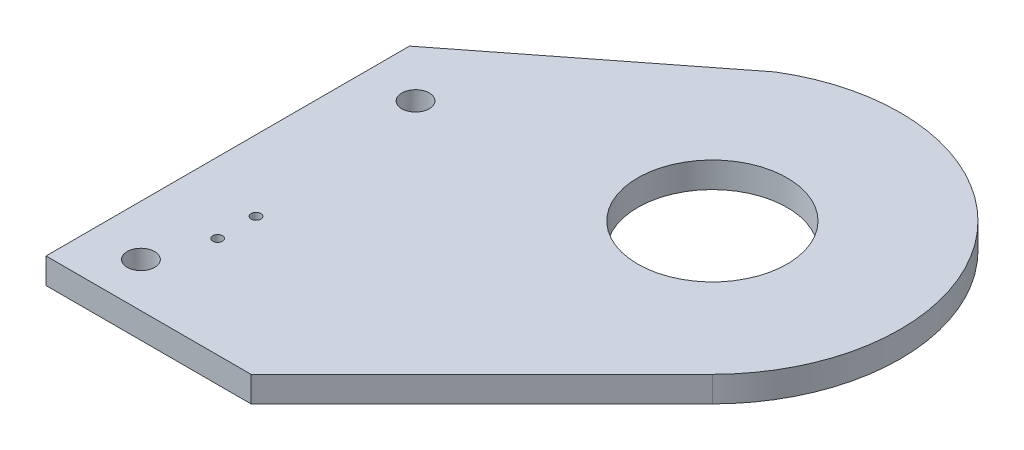
ISO-10303-21;
HEADER;
FILE_DESCRIPTION(('STEP AP214'),'2;1');
FILE_NAME('part.step','',(''),(''),'','','');
FILE_SCHEMA(('AUTOMOTIVE_DESIGN { 1 0 10303 214 1 1 1 1 }'));
ENDSEC;
DATA;
#1=APPLICATION_CONTEXT('core data for automotive mechanical design processes');
#2=APPLICATION_PROTOCOL_DEFINITION('international standard','automotive_design',2000,#1);
#3=PRODUCT_CONTEXT('',#1,'mechanical');
#4=PRODUCT('Part','Part','',(#3));
#5=PRODUCT_RELATED_PRODUCT_CATEGORY('part','',(#4));
#6=PRODUCT_DEFINITION_FORMATION('','',#4);
#7=PRODUCT_DEFINITION_CONTEXT('part definition',#1,'design');
#8=PRODUCT_DEFINITION('design','',#6,#7);
#9=PRODUCT_DEFINITION_SHAPE('','',#8);
#10=(LENGTH_UNIT() NAMED_UNIT(*) SI_UNIT(.MILLI.,.METRE.));
#11=(NAMED_UNIT(*) PLANE_ANGLE_UNIT() SI_UNIT($,.RADIAN.));
#12=(NAMED_UNIT(*) SI_UNIT($,.STERADIAN.) SOLID_ANGLE_UNIT());
#13=UNCERTAINTY_MEASURE_WITH_UNIT(LENGTH_MEASURE(1.E-05),#10,'distance_accuracy_value','');
#14=(GEOMETRIC_REPRESENTATION_CONTEXT(3) GLOBAL_UNCERTAINTY_ASSIGNED_CONTEXT((#13)) GLOBAL_UNIT_ASSIGNED_CONTEXT((#10,
#11,#12)) REPRESENTATION_CONTEXT('',''));
#15=CARTESIAN_POINT('',(0.,0.,0.));
#16=DIRECTION('',(0.,0.,1.));
#17=DIRECTION('',(1.,0.,0.));
#18=AXIS2_PLACEMENT_3D('',#15,#16,#17);
#19=CARTESIAN_POINT('',(0.,-6.35,0.));
#20=DIRECTION('',(-1.,0.,0.));
#21=DIRECTION('',(0.,0.,1.));
#22=AXIS2_PLACEMENT_3D('',#19,#20,#21);
#23=PLANE('',#22);
#24=DIRECTION('',(0.,0.,1.));
#25=VECTOR('',#24,1.);
#26=CARTESIAN_POINT('',(0.,0.,0.));
#27=LINE('',#26,#25);
#28=CARTESIAN_POINT('',(0.,0.,-90.));
#29=VERTEX_POINT('',#28);
#30=CARTESIAN_POINT('',(0.,0.,0.));
#31=VERTEX_POINT('',#30);
#32=EDGE_CURVE('E118',#29,#31,#27,.T.);
#33=ORIENTED_EDGE('',*,*,#32,.F.);
#34=DIRECTION('',(0.,1.,0.));
#35=VECTOR('',#34,1.);
#36=CARTESIAN_POINT('',(0.,-6.35,-90.));
#37=LINE('',#36,#35);
#38=CARTESIAN_POINT('',(0.,-6.35,-90.));
#39=VERTEX_POINT('',#38);
#40=EDGE_CURVE('E11',#39,#29,#37,.T.);
#41=ORIENTED_EDGE('',*,*,#40,.F.);
#42=DIRECTION('',(0.,0.,1.));
#43=VECTOR('',#42,1.);
#44=CARTESIAN_POINT('',(0.,-6.35,0.));
#45=LINE('',#44,#43);
#46=CARTESIAN_POINT('',(0.,-6.35,0.));
#47=VERTEX_POINT('',#46);
#48=EDGE_CURVE('E113',#39,#47,#45,.T.);
#49=ORIENTED_EDGE('',*,*,#48,.T.);
#50=DIRECTION('',(0.,1.,0.));
#51=VECTOR('',#50,1.);
#52=CARTESIAN_POINT('',(0.,-6.35,0.));
#53=LINE('',#52,#51);
#54=EDGE_CURVE('E44',#47,#31,#53,.T.);
#55=ORIENTED_EDGE('',*,*,#54,.T.);
#56=EDGE_LOOP('',(#33,#41,#49,#55));
#57=FACE_BOUND('',#56,.T.);
#58=ADVANCED_FACE('F41',(#57),#23,.T.);
#59=CARTESIAN_POINT('',(0.,-6.35,-90.));
#60=DIRECTION('',(-0.615892028317826,0.,-0.787830571540959));
#61=DIRECTION('',(-0.787830571540959,0.,0.615892028317826));
#62=AXIS2_PLACEMENT_3D('',#59,#60,#61);
#63=PLANE('',#62);
#64=DIRECTION('',(-0.787830571540959,0.,0.615892028317826));
#65=VECTOR('',#64,1.);
#66=CARTESIAN_POINT('',(0.,0.,-90.));
#67=LINE('',#66,#65);
#68=CARTESIAN_POINT('',(50.7609306503488,0.,-129.682710555893));
#69=VERTEX_POINT('',#68);
#70=EDGE_CURVE('E128',#69,#29,#67,.T.);
#71=ORIENTED_EDGE('',*,*,#70,.F.);
#72=DIRECTION('',(0.,1.,0.));
#73=VECTOR('',#72,1.);
#74=CARTESIAN_POINT('',(50.7609306503488,-6.35,-129.682710555893));
#75=LINE('',#74,#73);
#76=CARTESIAN_POINT('',(50.7609306503488,-6.35,-129.682710555893));
#77=VERTEX_POINT('',#76);
#78=EDGE_CURVE('E50',#77,#69,#75,.T.);
#79=ORIENTED_EDGE('',*,*,#78,.F.);
#80=DIRECTION('',(-0.787830571540959,0.,0.615892028317826));
#81=VECTOR('',#80,1.);
#82=CARTESIAN_POINT('',(0.,-6.35,-90.));
#83=LINE('',#82,#81);
#84=EDGE_CURVE('E108',#77,#39,#83,.T.);
#85=ORIENTED_EDGE('',*,*,#84,.T.);
#86=ORIENTED_EDGE('',*,*,#40,.T.);
#87=EDGE_LOOP('',(#71,#79,#85,#86));
#88=FACE_BOUND('',#87,.T.);
#89=ADVANCED_FACE('F134',(#88),#63,.T.);
#90=CARTESIAN_POINT('',(75.,-6.35,-90.));
#91=DIRECTION('',(0.,1.,0.));
#92=DIRECTION('',(0.,0.,1.));
#93=AXIS2_PLACEMENT_3D('',#90,#91,#92);
#94=CYLINDRICAL_SURFACE('',#93,46.5);
#95=CARTESIAN_POINT('',(75.,0.,-90.));
#96=DIRECTION('',(0.,1.,0.));
#97=DIRECTION('',(0.,0.,-1.));
#98=AXIS2_PLACEMENT_3D('',#95,#96,#97);
#99=CIRCLE('',#98,46.5);
#100=CARTESIAN_POINT('',(107.880465325174,0.,-57.1195346748255));
#101=VERTEX_POINT('',#100);
#102=EDGE_CURVE('E97',#101,#69,#99,.T.);
#103=ORIENTED_EDGE('',*,*,#102,.F.);
#104=DIRECTION('',(0.,1.,0.));
#105=VECTOR('',#104,1.);
#106=CARTESIAN_POINT('',(107.880465325174,-6.35,-57.1195346748255));
#107=LINE('',#106,#105);
#108=CARTESIAN_POINT('',(107.880465325174,-6.35,-57.1195346748255));
#109=VERTEX_POINT('',#108);
#110=EDGE_CURVE('E92',#109,#101,#107,.T.);
#111=ORIENTED_EDGE('',*,*,#110,.F.);
#112=CARTESIAN_POINT('',(75.,-6.35,-90.));
#113=DIRECTION('',(0.,1.,0.));
#114=DIRECTION('',(0.,0.,-1.));
#115=AXIS2_PLACEMENT_3D('',#112,#113,#114);
#116=CIRCLE('',#115,46.5);
#117=EDGE_CURVE('E95',#109,#77,#116,.T.);
#118=ORIENTED_EDGE('',*,*,#117,.T.);
#119=ORIENTED_EDGE('',*,*,#78,.T.);
#120=EDGE_LOOP('',(#103,#111,#118,#119));
#121=FACE_BOUND('',#120,.T.);
#122=ADVANCED_FACE('F94',(#121),#94,.T.);
#123=CARTESIAN_POINT('',(107.880465325174,-6.35,-57.1195346748255));
#124=DIRECTION('',(0.707106781186547,0.,0.707106781186548));
#125=DIRECTION('',(0.707106781186548,0.,-0.707106781186547));
#126=AXIS2_PLACEMENT_3D('',#123,#124,#125);
#127=PLANE('',#126);
#128=DIRECTION('',(0.707106781186548,0.,-0.707106781186547));
#129=VECTOR('',#128,1.);
#130=CARTESIAN_POINT('',(107.880465325174,0.,-57.1195346748255));
#131=LINE('',#130,#129);
#132=CARTESIAN_POINT('',(50.7609306503488,0.,0.));
#133=VERTEX_POINT('',#132);
#134=EDGE_CURVE('E125',#133,#101,#131,.T.);
#135=ORIENTED_EDGE('',*,*,#134,.F.);
#136=DIRECTION('',(0.,1.,0.));
#137=VECTOR('',#136,1.);
#138=CARTESIAN_POINT('',(50.7609306503488,-6.35,0.));
#139=LINE('',#138,#137);
#140=CARTESIAN_POINT('',(50.7609306503488,-6.35,0.));
#141=VERTEX_POINT('',#140);
#142=EDGE_CURVE('E102',#141,#133,#139,.T.);
#143=ORIENTED_EDGE('',*,*,#142,.F.);
#144=DIRECTION('',(0.707106781186548,0.,-0.707106781186547));
#145=VECTOR('',#144,1.);
#146=CARTESIAN_POINT('',(107.880465325174,-6.35,-57.1195346748255));
#147=LINE('',#146,#145);
#148=EDGE_CURVE('E107',#141,#109,#147,.T.);
#149=ORIENTED_EDGE('',*,*,#148,.T.);
#150=ORIENTED_EDGE('',*,*,#110,.T.);
#151=EDGE_LOOP('',(#135,#143,#149,#150));
#152=FACE_BOUND('',#151,.T.);
#153=ADVANCED_FACE('F110',(#152),#127,.T.);
#154=CARTESIAN_POINT('',(0.,-6.35,0.));
#155=DIRECTION('',(0.,0.,1.));
#156=DIRECTION('',(1.,0.,0.));
#157=AXIS2_PLACEMENT_3D('',#154,#155,#156);
#158=PLANE('',#157);
#159=DIRECTION('',(1.,0.,0.));
#160=VECTOR('',#159,1.);
#161=CARTESIAN_POINT('',(0.,0.,0.));
#162=LINE('',#161,#160);
#163=EDGE_CURVE('E121',#31,#133,#162,.T.);
#164=ORIENTED_EDGE('',*,*,#163,.F.);
#165=ORIENTED_EDGE('',*,*,#54,.F.);
#166=DIRECTION('',(1.,0.,0.));
#167=VECTOR('',#166,1.);
#168=CARTESIAN_POINT('',(0.,-6.35,0.));
#169=LINE('',#168,#167);
#170=EDGE_CURVE('E111',#47,#141,#169,.T.);
#171=ORIENTED_EDGE('',*,*,#170,.T.);
#172=ORIENTED_EDGE('',*,*,#142,.T.);
#173=EDGE_LOOP('',(#164,#165,#171,#172));
#174=FACE_BOUND('',#173,.T.);
#175=ADVANCED_FACE('F131',(#174),#158,.T.);
#176=CARTESIAN_POINT('',(75.,-6.35,-90.));
#177=DIRECTION('',(0.,-1.,0.));
#178=DIRECTION('',(0.,0.,-1.));
#179=AXIS2_PLACEMENT_3D('',#176,#177,#178);
#180=PLANE('',#179);
#181=CARTESIAN_POINT('',(17.5,-6.35,-25.));
#182=DIRECTION('',(0.,1.,0.));
#183=DIRECTION('',(0.,0.,1.));
#184=AXIS2_PLACEMENT_3D('',#181,#182,#183);
#185=CIRCLE('',#184,1.2);
#186=CARTESIAN_POINT('',(17.5,-6.35,-23.8));
#187=VERTEX_POINT('',#186);
#188=EDGE_CURVE('E181',#187,#187,#185,.T.);
#189=ORIENTED_EDGE('',*,*,#188,.T.);
#190=EDGE_LOOP('',(#189));
#191=FACE_BOUND('',#190,.T.);
#192=CARTESIAN_POINT('',(17.5,-6.35,-34.5));
#193=DIRECTION('',(0.,1.,0.));
#194=DIRECTION('',(0.,0.,1.));
#195=AXIS2_PLACEMENT_3D('',#192,#193,#194);
#196=CIRCLE('',#195,1.2);
#197=CARTESIAN_POINT('',(17.5,-6.35,-33.3));
#198=VERTEX_POINT('',#197);
#199=EDGE_CURVE('E190',#198,#198,#196,.T.);
#200=ORIENTED_EDGE('',*,*,#199,.T.);
#201=EDGE_LOOP('',(#200));
#202=FACE_BOUND('',#201,.T.);
#203=CARTESIAN_POINT('',(75.,-6.35,-90.));
#204=DIRECTION('',(0.,1.,0.));
#205=DIRECTION('',(0.,0.,1.));
#206=AXIS2_PLACEMENT_3D('',#203,#204,#205);
#207=CIRCLE('',#206,18.5);
#208=CARTESIAN_POINT('',(75.,-6.35,-71.5));
#209=VERTEX_POINT('',#208);
#210=EDGE_CURVE('E195',#209,#209,#207,.T.);
#211=ORIENTED_EDGE('',*,*,#210,.T.);
#212=EDGE_LOOP('',(#211));
#213=FACE_BOUND('',#212,.T.);
#214=CARTESIAN_POINT('',(12.5,-6.35,-79.));
#215=DIRECTION('',(0.,1.,0.));
#216=DIRECTION('',(0.,0.,1.));
#217=AXIS2_PLACEMENT_3D('',#214,#215,#216);
#218=CIRCLE('',#217,3.4);
#219=CARTESIAN_POINT('',(12.5,-6.35,-75.6));
#220=VERTEX_POINT('',#219);
#221=EDGE_CURVE('E122',#220,#220,#218,.T.);
#222=ORIENTED_EDGE('',*,*,#221,.T.);
#223=EDGE_LOOP('',(#222));
#224=FACE_BOUND('',#223,.T.);
#225=CARTESIAN_POINT('',(12.5,-6.35,-11.));
#226=DIRECTION('',(0.,1.,0.));
#227=DIRECTION('',(0.,0.,-1.));
#228=AXIS2_PLACEMENT_3D('',#225,#226,#227);
#229=CIRCLE('',#228,3.4);
#230=CARTESIAN_POINT('',(12.5,-6.35,-14.4));
#231=VERTEX_POINT('',#230);
#232=EDGE_CURVE('E198',#231,#231,#229,.T.);
#233=ORIENTED_EDGE('',*,*,#232,.T.);
#234=EDGE_LOOP('',(#233));
#235=FACE_BOUND('',#234,.T.);
#236=ORIENTED_EDGE('',*,*,#48,.F.);
#237=ORIENTED_EDGE('',*,*,#84,.F.);
#238=ORIENTED_EDGE('',*,*,#117,.F.);
#239=ORIENTED_EDGE('',*,*,#148,.F.);
#240=ORIENTED_EDGE('',*,*,#170,.F.);
#241=EDGE_LOOP('',(#236,#237,#238,#239,#240));
#242=FACE_BOUND('',#241,.T.);
#243=ADVANCED_FACE('F106',(#191,#202,#213,#224,#235,#242),#180,.T.);
#244=CARTESIAN_POINT('',(75.,0.,-90.));
#245=DIRECTION('',(0.,-1.,0.));
#246=DIRECTION('',(0.,0.,-1.));
#247=AXIS2_PLACEMENT_3D('',#244,#245,#246);
#248=PLANE('',#247);
#249=CARTESIAN_POINT('',(17.5,0.,-25.));
#250=DIRECTION('',(0.,1.,0.));
#251=DIRECTION('',(0.,0.,1.));
#252=AXIS2_PLACEMENT_3D('',#249,#250,#251);
#253=CIRCLE('',#252,1.2);
#254=CARTESIAN_POINT('',(17.5,0.,-23.8));
#255=VERTEX_POINT('',#254);
#256=EDGE_CURVE('E184',#255,#255,#253,.T.);
#257=ORIENTED_EDGE('',*,*,#256,.F.);
#258=EDGE_LOOP('',(#257));
#259=FACE_BOUND('',#258,.T.);
#260=CARTESIAN_POINT('',(17.5,0.,-34.5));
#261=DIRECTION('',(0.,1.,0.));
#262=DIRECTION('',(0.,0.,1.));
#263=AXIS2_PLACEMENT_3D('',#260,#261,#262);
#264=CIRCLE('',#263,1.2);
#265=CARTESIAN_POINT('',(17.5,0.,-33.3));
#266=VERTEX_POINT('',#265);
#267=EDGE_CURVE('E185',#266,#266,#264,.T.);
#268=ORIENTED_EDGE('',*,*,#267,.F.);
#269=EDGE_LOOP('',(#268));
#270=FACE_BOUND('',#269,.T.);
#271=CARTESIAN_POINT('',(75.,0.,-90.));
#272=DIRECTION('',(0.,1.,0.));
#273=DIRECTION('',(0.,0.,1.));
#274=AXIS2_PLACEMENT_3D('',#271,#272,#273);
#275=CIRCLE('',#274,18.5);
#276=CARTESIAN_POINT('',(75.,0.,-71.5));
#277=VERTEX_POINT('',#276);
#278=EDGE_CURVE('E187',#277,#277,#275,.T.);
#279=ORIENTED_EDGE('',*,*,#278,.F.);
#280=EDGE_LOOP('',(#279));
#281=FACE_BOUND('',#280,.T.);
#282=CARTESIAN_POINT('',(12.5,0.,-79.));
#283=DIRECTION('',(0.,1.,0.));
#284=DIRECTION('',(0.,0.,1.));
#285=AXIS2_PLACEMENT_3D('',#282,#283,#284);
#286=CIRCLE('',#285,3.4);
#287=CARTESIAN_POINT('',(12.5,0.,-75.6));
#288=VERTEX_POINT('',#287);
#289=EDGE_CURVE('E203',#288,#288,#286,.T.);
#290=ORIENTED_EDGE('',*,*,#289,.F.);
#291=EDGE_LOOP('',(#290));
#292=FACE_BOUND('',#291,.T.);
#293=CARTESIAN_POINT('',(12.5,0.,-11.));
#294=DIRECTION('',(0.,1.,0.));
#295=DIRECTION('',(0.,0.,-1.));
#296=AXIS2_PLACEMENT_3D('',#293,#294,#295);
#297=CIRCLE('',#296,3.4);
#298=CARTESIAN_POINT('',(12.5,0.,-14.4));
#299=VERTEX_POINT('',#298);
#300=EDGE_CURVE('E206',#299,#299,#297,.T.);
#301=ORIENTED_EDGE('',*,*,#300,.F.);
#302=EDGE_LOOP('',(#301));
#303=FACE_BOUND('',#302,.T.);
#304=ORIENTED_EDGE('',*,*,#32,.T.);
#305=ORIENTED_EDGE('',*,*,#163,.T.);
#306=ORIENTED_EDGE('',*,*,#134,.T.);
#307=ORIENTED_EDGE('',*,*,#102,.T.);
#308=ORIENTED_EDGE('',*,*,#70,.T.);
#309=EDGE_LOOP('',(#304,#305,#306,#307,#308));
#310=FACE_BOUND('',#309,.T.);
#311=ADVANCED_FACE('F133',(#259,#270,#281,#292,#303,#310),#248,.F.);
#312=CARTESIAN_POINT('',(12.5,-6.35,-11.));
#313=DIRECTION('',(0.,1.,0.));
#314=DIRECTION('',(0.,0.,1.));
#315=AXIS2_PLACEMENT_3D('',#312,#313,#314);
#316=CYLINDRICAL_SURFACE('',#315,3.4);
#317=ORIENTED_EDGE('',*,*,#232,.F.);
#318=EDGE_LOOP('',(#317));
#319=FACE_BOUND('',#318,.T.);
#320=ORIENTED_EDGE('',*,*,#300,.T.);
#321=EDGE_LOOP('',(#320));
#322=FACE_BOUND('',#321,.T.);
#323=ADVANCED_FACE('F154',(#319,#322),#316,.F.);
#324=CARTESIAN_POINT('',(12.5,-6.35,-79.));
#325=DIRECTION('',(0.,1.,0.));
#326=DIRECTION('',(0.,0.,1.));
#327=AXIS2_PLACEMENT_3D('',#324,#325,#326);
#328=CYLINDRICAL_SURFACE('',#327,3.4);
#329=ORIENTED_EDGE('',*,*,#221,.F.);
#330=EDGE_LOOP('',(#329));
#331=FACE_BOUND('',#330,.T.);
#332=ORIENTED_EDGE('',*,*,#289,.T.);
#333=EDGE_LOOP('',(#332));
#334=FACE_BOUND('',#333,.T.);
#335=ADVANCED_FACE('F161',(#331,#334),#328,.F.);
#336=CARTESIAN_POINT('',(75.,-6.35,-90.));
#337=DIRECTION('',(0.,1.,0.));
#338=DIRECTION('',(0.,0.,1.));
#339=AXIS2_PLACEMENT_3D('',#336,#337,#338);
#340=CYLINDRICAL_SURFACE('',#339,18.5);
#341=ORIENTED_EDGE('',*,*,#210,.F.);
#342=EDGE_LOOP('',(#341));
#343=FACE_BOUND('',#342,.T.);
#344=ORIENTED_EDGE('',*,*,#278,.T.);
#345=EDGE_LOOP('',(#344));
#346=FACE_BOUND('',#345,.T.);
#347=ADVANCED_FACE('F165',(#343,#346),#340,.F.);
#348=CARTESIAN_POINT('',(17.5,-6.35,-34.5));
#349=DIRECTION('',(0.,1.,0.));
#350=DIRECTION('',(0.,0.,1.));
#351=AXIS2_PLACEMENT_3D('',#348,#349,#350);
#352=CYLINDRICAL_SURFACE('',#351,1.2);
#353=ORIENTED_EDGE('',*,*,#199,.F.);
#354=EDGE_LOOP('',(#353));
#355=FACE_BOUND('',#354,.T.);
#356=ORIENTED_EDGE('',*,*,#267,.T.);
#357=EDGE_LOOP('',(#356));
#358=FACE_BOUND('',#357,.T.);
#359=ADVANCED_FACE('F169',(#355,#358),#352,.F.);
#360=CARTESIAN_POINT('',(17.5,-6.35,-25.));
#361=DIRECTION('',(0.,1.,0.));
#362=DIRECTION('',(0.,0.,1.));
#363=AXIS2_PLACEMENT_3D('',#360,#361,#362);
#364=CYLINDRICAL_SURFACE('',#363,1.2);
#365=ORIENTED_EDGE('',*,*,#188,.F.);
#366=EDGE_LOOP('',(#365));
#367=FACE_BOUND('',#366,.T.);
#368=ORIENTED_EDGE('',*,*,#256,.T.);
#369=EDGE_LOOP('',(#368));
#370=FACE_BOUND('',#369,.T.);
#371=ADVANCED_FACE('F173',(#367,#370),#364,.F.);
#372=CLOSED_SHELL('',(#58,#89,#122,#153,#175,#243,#311,#323,#335,#347,#359,#371));
#373=MANIFOLD_SOLID_BREP('B2',#372);
#374=ADVANCED_BREP_SHAPE_REPRESENTATION('',(#18,#373),#14);
#375=SHAPE_DEFINITION_REPRESENTATION(#9,#374);
ENDSEC;
END-ISO-10303-21;
